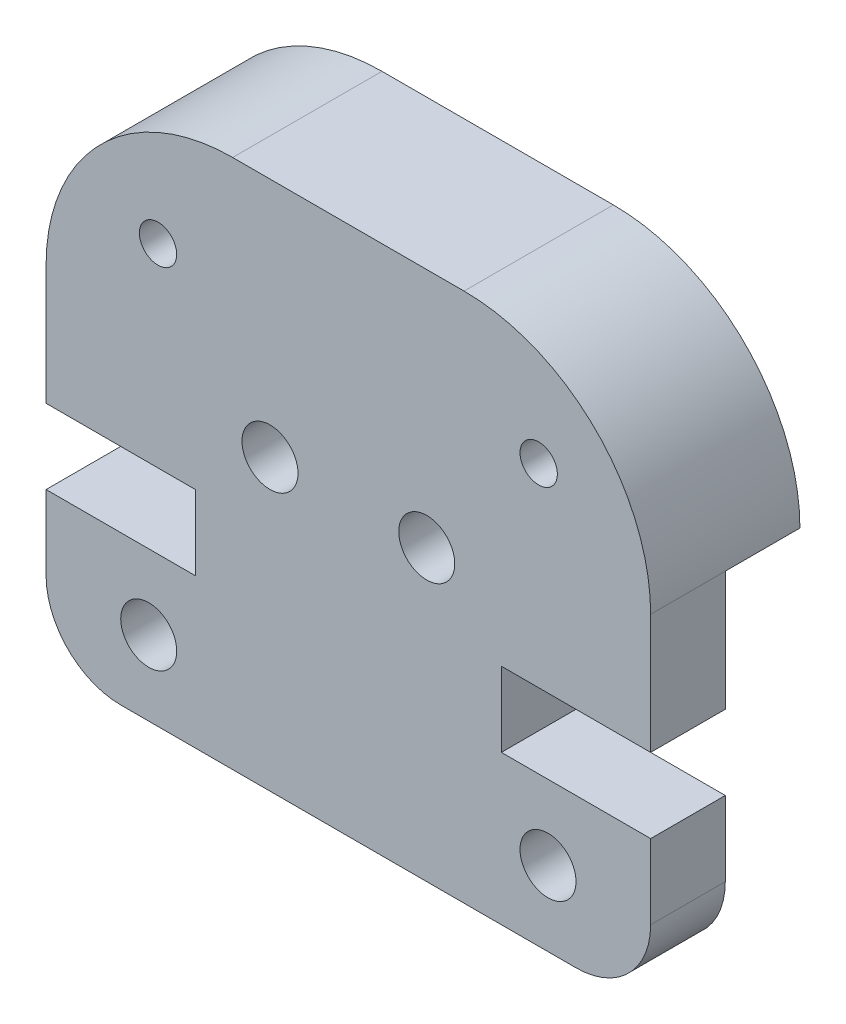
ISO-10303-21;
HEADER;
FILE_DESCRIPTION(('STEP AP214'),'2;1');
FILE_NAME('part.step','',(''),(''),'','','');
FILE_SCHEMA(('AUTOMOTIVE_DESIGN { 1 0 10303 214 1 1 1 1 }'));
ENDSEC;
DATA;
#1=APPLICATION_CONTEXT('core data for automotive mechanical design processes');
#2=APPLICATION_PROTOCOL_DEFINITION('international standard','automotive_design',2000,#1);
#3=PRODUCT_CONTEXT('',#1,'mechanical');
#4=PRODUCT('Part','Part','',(#3));
#5=PRODUCT_RELATED_PRODUCT_CATEGORY('part','',(#4));
#6=PRODUCT_DEFINITION_FORMATION('','',#4);
#7=PRODUCT_DEFINITION_CONTEXT('part definition',#1,'design');
#8=PRODUCT_DEFINITION('design','',#6,#7);
#9=PRODUCT_DEFINITION_SHAPE('','',#8);
#10=(LENGTH_UNIT() NAMED_UNIT(*) SI_UNIT(.MILLI.,.METRE.));
#11=(NAMED_UNIT(*) PLANE_ANGLE_UNIT() SI_UNIT($,.RADIAN.));
#12=(NAMED_UNIT(*) SI_UNIT($,.STERADIAN.) SOLID_ANGLE_UNIT());
#13=UNCERTAINTY_MEASURE_WITH_UNIT(LENGTH_MEASURE(1.E-05),#10,'distance_accuracy_value','');
#14=(GEOMETRIC_REPRESENTATION_CONTEXT(3) GLOBAL_UNCERTAINTY_ASSIGNED_CONTEXT((#13)) GLOBAL_UNIT_ASSIGNED_CONTEXT((#10,
#11,#12)) REPRESENTATION_CONTEXT('',''));
#15=CARTESIAN_POINT('',(0.,0.,0.));
#16=DIRECTION('',(0.,0.,1.));
#17=DIRECTION('',(1.,0.,0.));
#18=AXIS2_PLACEMENT_3D('',#15,#16,#17);
#19=CARTESIAN_POINT('',(14.2,2.00000000000002,4.));
#20=DIRECTION('',(0.,0.,-1.));
#21=DIRECTION('',(-1.,0.,0.));
#22=AXIS2_PLACEMENT_3D('',#19,#20,#21);
#23=CYLINDRICAL_SURFACE('',#22,2.00000000000001);
#24=CARTESIAN_POINT('',(14.2,2.00000000000002,2.));
#25=DIRECTION('',(0.,0.,-1.));
#26=DIRECTION('',(-1.,0.,0.));
#27=AXIS2_PLACEMENT_3D('',#24,#25,#26);
#28=CIRCLE('',#27,2.00000000000001);
#29=CARTESIAN_POINT('',(16.2,2.00000000000002,2.));
#30=VERTEX_POINT('',#29);
#31=CARTESIAN_POINT('',(14.2,0.,2.));
#32=VERTEX_POINT('',#31);
#33=EDGE_CURVE('E49',#30,#32,#28,.T.);
#34=ORIENTED_EDGE('',*,*,#33,.F.);
#35=DIRECTION('',(0.,0.,-1.));
#36=VECTOR('',#35,1.);
#37=CARTESIAN_POINT('',(16.2,2.00000000000002,4.));
#38=LINE('',#37,#36);
#39=CARTESIAN_POINT('',(16.2,2.00000000000002,4.));
#40=VERTEX_POINT('',#39);
#41=EDGE_CURVE('E11',#40,#30,#38,.T.);
#42=ORIENTED_EDGE('',*,*,#41,.F.);
#43=CARTESIAN_POINT('',(14.2,2.00000000000002,4.));
#44=DIRECTION('',(0.,0.,1.));
#45=DIRECTION('',(-1.,0.,0.));
#46=AXIS2_PLACEMENT_3D('',#43,#44,#45);
#47=CIRCLE('',#46,2.00000000000001);
#48=CARTESIAN_POINT('',(14.2,0.,4.));
#49=VERTEX_POINT('',#48);
#50=EDGE_CURVE('E160',#49,#40,#47,.T.);
#51=ORIENTED_EDGE('',*,*,#50,.F.);
#52=DIRECTION('',(0.,0.,-1.));
#53=VECTOR('',#52,1.);
#54=CARTESIAN_POINT('',(14.2,0.,4.));
#55=LINE('',#54,#53);
#56=EDGE_CURVE('E149',#49,#32,#55,.T.);
#57=ORIENTED_EDGE('',*,*,#56,.T.);
#58=EDGE_LOOP('',(#34,#42,#51,#57));
#59=FACE_BOUND('',#58,.T.);
#60=ADVANCED_FACE('F34',(#59),#23,.T.);
#61=CARTESIAN_POINT('',(16.2,2.00000000000002,4.));
#62=DIRECTION('',(-1.,0.,0.));
#63=DIRECTION('',(0.,0.,1.));
#64=AXIS2_PLACEMENT_3D('',#61,#62,#63);
#65=PLANE('',#64);
#66=DIRECTION('',(0.,-1.,0.));
#67=VECTOR('',#66,1.);
#68=CARTESIAN_POINT('',(16.2,9.205,2.));
#69=LINE('',#68,#67);
#70=CARTESIAN_POINT('',(16.2,4.00000000000002,2.));
#71=VERTEX_POINT('',#70);
#72=EDGE_CURVE('E208',#71,#30,#69,.T.);
#73=ORIENTED_EDGE('',*,*,#72,.F.);
#74=DIRECTION('',(0.,0.,-1.));
#75=VECTOR('',#74,1.);
#76=CARTESIAN_POINT('',(16.2,4.00000000000002,4.));
#77=LINE('',#76,#75);
#78=CARTESIAN_POINT('',(16.2,4.00000000000002,4.));
#79=VERTEX_POINT('',#78);
#80=EDGE_CURVE('E42',#79,#71,#77,.T.);
#81=ORIENTED_EDGE('',*,*,#80,.F.);
#82=DIRECTION('',(0.,1.,0.));
#83=VECTOR('',#82,1.);
#84=CARTESIAN_POINT('',(16.2,2.00000000000002,4.));
#85=LINE('',#84,#83);
#86=EDGE_CURVE('E82',#40,#79,#85,.T.);
#87=ORIENTED_EDGE('',*,*,#86,.F.);
#88=ORIENTED_EDGE('',*,*,#41,.T.);
#89=EDGE_LOOP('',(#73,#81,#87,#88));
#90=FACE_BOUND('',#89,.T.);
#91=ADVANCED_FACE('F207',(#90),#65,.F.);
#92=CARTESIAN_POINT('',(12.2,4.00000000000002,4.));
#93=DIRECTION('',(0.,-1.,0.));
#94=DIRECTION('',(1.,0.,0.));
#95=AXIS2_PLACEMENT_3D('',#92,#93,#94);
#96=PLANE('',#95);
#97=DIRECTION('',(1.,0.,0.));
#98=VECTOR('',#97,1.);
#99=CARTESIAN_POINT('',(12.2,4.00000000000002,2.));
#100=LINE('',#99,#98);
#101=CARTESIAN_POINT('',(12.2,4.00000000000002,2.));
#102=VERTEX_POINT('',#101);
#103=EDGE_CURVE('E201',#102,#71,#100,.T.);
#104=ORIENTED_EDGE('',*,*,#103,.F.);
#105=DIRECTION('',(0.,0.,-1.));
#106=VECTOR('',#105,1.);
#107=CARTESIAN_POINT('',(12.2,4.00000000000002,4.));
#108=LINE('',#107,#106);
#109=CARTESIAN_POINT('',(12.2,4.00000000000002,4.));
#110=VERTEX_POINT('',#109);
#111=EDGE_CURVE('E190',#110,#102,#108,.T.);
#112=ORIENTED_EDGE('',*,*,#111,.F.);
#113=DIRECTION('',(-1.,0.,0.));
#114=VECTOR('',#113,1.);
#115=CARTESIAN_POINT('',(12.2,4.00000000000002,4.));
#116=LINE('',#115,#114);
#117=EDGE_CURVE('E202',#79,#110,#116,.T.);
#118=ORIENTED_EDGE('',*,*,#117,.F.);
#119=ORIENTED_EDGE('',*,*,#80,.T.);
#120=EDGE_LOOP('',(#104,#112,#118,#119));
#121=FACE_BOUND('',#120,.T.);
#122=ADVANCED_FACE('F198',(#121),#96,.F.);
#123=CARTESIAN_POINT('',(12.2,6.00000000000003,4.));
#124=DIRECTION('',(-1.,0.,0.));
#125=DIRECTION('',(0.,-1.,0.));
#126=AXIS2_PLACEMENT_3D('',#123,#124,#125);
#127=PLANE('',#126);
#128=DIRECTION('',(0.,-1.,0.));
#129=VECTOR('',#128,1.);
#130=CARTESIAN_POINT('',(12.2,6.00000000000003,2.));
#131=LINE('',#130,#129);
#132=CARTESIAN_POINT('',(12.2,6.00000000000003,2.));
#133=VERTEX_POINT('',#132);
#134=EDGE_CURVE('E252',#133,#102,#131,.T.);
#135=ORIENTED_EDGE('',*,*,#134,.F.);
#136=DIRECTION('',(0.,0.,-1.));
#137=VECTOR('',#136,1.);
#138=CARTESIAN_POINT('',(12.2,6.00000000000003,4.));
#139=LINE('',#138,#137);
#140=CARTESIAN_POINT('',(12.2,6.00000000000003,4.));
#141=VERTEX_POINT('',#140);
#142=EDGE_CURVE('E187',#141,#133,#139,.T.);
#143=ORIENTED_EDGE('',*,*,#142,.F.);
#144=DIRECTION('',(0.,1.,0.));
#145=VECTOR('',#144,1.);
#146=CARTESIAN_POINT('',(12.2,6.00000000000003,4.));
#147=LINE('',#146,#145);
#148=EDGE_CURVE('E283',#110,#141,#147,.T.);
#149=ORIENTED_EDGE('',*,*,#148,.F.);
#150=ORIENTED_EDGE('',*,*,#111,.T.);
#151=EDGE_LOOP('',(#135,#143,#149,#150));
#152=FACE_BOUND('',#151,.T.);
#153=ADVANCED_FACE('F326',(#152),#127,.F.);
#154=CARTESIAN_POINT('',(16.2,6.00000000000003,4.));
#155=DIRECTION('',(0.,1.,0.));
#156=DIRECTION('',(-1.,0.,0.));
#157=AXIS2_PLACEMENT_3D('',#154,#155,#156);
#158=PLANE('',#157);
#159=DIRECTION('',(-1.,0.,0.));
#160=VECTOR('',#159,1.);
#161=CARTESIAN_POINT('',(16.2,6.00000000000003,2.));
#162=LINE('',#161,#160);
#163=CARTESIAN_POINT('',(16.2,6.00000000000003,2.));
#164=VERTEX_POINT('',#163);
#165=EDGE_CURVE('E249',#164,#133,#162,.T.);
#166=ORIENTED_EDGE('',*,*,#165,.F.);
#167=DIRECTION('',(0.,0.,-1.));
#168=VECTOR('',#167,1.);
#169=CARTESIAN_POINT('',(16.2,6.00000000000003,4.));
#170=LINE('',#169,#168);
#171=CARTESIAN_POINT('',(16.2,6.00000000000003,4.));
#172=VERTEX_POINT('',#171);
#173=EDGE_CURVE('E184',#172,#164,#170,.T.);
#174=ORIENTED_EDGE('',*,*,#173,.F.);
#175=DIRECTION('',(1.,0.,0.));
#176=VECTOR('',#175,1.);
#177=CARTESIAN_POINT('',(16.2,6.00000000000003,4.));
#178=LINE('',#177,#176);
#179=EDGE_CURVE('E285',#141,#172,#178,.T.);
#180=ORIENTED_EDGE('',*,*,#179,.F.);
#181=ORIENTED_EDGE('',*,*,#142,.T.);
#182=EDGE_LOOP('',(#166,#174,#180,#181));
#183=FACE_BOUND('',#182,.T.);
#184=ADVANCED_FACE('F330',(#183),#158,.F.);
#185=CARTESIAN_POINT('',(16.2,9.205,4.));
#186=DIRECTION('',(-1.,0.,0.));
#187=DIRECTION('',(0.,-1.,0.));
#188=AXIS2_PLACEMENT_3D('',#185,#186,#187);
#189=PLANE('',#188);
#190=CARTESIAN_POINT('',(16.2,9.205,2.));
#191=VERTEX_POINT('',#190);
#192=EDGE_CURVE('E210',#191,#164,#69,.T.);
#193=ORIENTED_EDGE('',*,*,#192,.F.);
#194=DIRECTION('',(0.,0.,-1.));
#195=VECTOR('',#194,1.);
#196=CARTESIAN_POINT('',(16.2,9.205,4.));
#197=LINE('',#196,#195);
#198=CARTESIAN_POINT('',(16.2,9.205,4.));
#199=VERTEX_POINT('',#198);
#200=EDGE_CURVE('E181',#199,#191,#197,.T.);
#201=ORIENTED_EDGE('',*,*,#200,.F.);
#202=DIRECTION('',(0.,1.,0.));
#203=VECTOR('',#202,1.);
#204=CARTESIAN_POINT('',(16.2,9.205,4.));
#205=LINE('',#204,#203);
#206=EDGE_CURVE('E287',#172,#199,#205,.T.);
#207=ORIENTED_EDGE('',*,*,#206,.F.);
#208=ORIENTED_EDGE('',*,*,#173,.T.);
#209=EDGE_LOOP('',(#193,#201,#207,#208));
#210=FACE_BOUND('',#209,.T.);
#211=ADVANCED_FACE('F377',(#210),#189,.F.);
#212=CARTESIAN_POINT('',(0.,9.20499999999999,4.));
#213=DIRECTION('',(1.,0.,0.));
#214=DIRECTION('',(0.,0.,-1.));
#215=AXIS2_PLACEMENT_3D('',#212,#213,#214);
#216=PLANE('',#215);
#217=DIRECTION('',(0.,1.,0.));
#218=VECTOR('',#217,1.);
#219=CARTESIAN_POINT('',(0.,0.,2.));
#220=LINE('',#219,#218);
#221=CARTESIAN_POINT('',(0.,6.00000000000003,2.));
#222=VERTEX_POINT('',#221);
#223=CARTESIAN_POINT('',(0.,9.20499999999999,2.));
#224=VERTEX_POINT('',#223);
#225=EDGE_CURVE('E350',#222,#224,#220,.T.);
#226=ORIENTED_EDGE('',*,*,#225,.F.);
#227=DIRECTION('',(0.,0.,-1.));
#228=VECTOR('',#227,1.);
#229=CARTESIAN_POINT('',(0.,6.00000000000003,4.));
#230=LINE('',#229,#228);
#231=CARTESIAN_POINT('',(0.,6.00000000000003,4.));
#232=VERTEX_POINT('',#231);
#233=EDGE_CURVE('E171',#232,#222,#230,.T.);
#234=ORIENTED_EDGE('',*,*,#233,.F.);
#235=DIRECTION('',(0.,-1.,0.));
#236=VECTOR('',#235,1.);
#237=CARTESIAN_POINT('',(0.,9.20499999999999,4.));
#238=LINE('',#237,#236);
#239=CARTESIAN_POINT('',(0.,9.20499999999999,4.));
#240=VERTEX_POINT('',#239);
#241=EDGE_CURVE('E295',#240,#232,#238,.T.);
#242=ORIENTED_EDGE('',*,*,#241,.F.);
#243=DIRECTION('',(0.,0.,-1.));
#244=VECTOR('',#243,1.);
#245=CARTESIAN_POINT('',(0.,9.20499999999999,4.));
#246=LINE('',#245,#244);
#247=EDGE_CURVE('E174',#240,#224,#246,.T.);
#248=ORIENTED_EDGE('',*,*,#247,.T.);
#249=EDGE_LOOP('',(#226,#234,#242,#248));
#250=FACE_BOUND('',#249,.T.);
#251=ADVANCED_FACE('F366',(#250),#216,.F.);
#252=CARTESIAN_POINT('',(0.,6.00000000000003,4.));
#253=DIRECTION('',(0.,1.,0.));
#254=DIRECTION('',(-1.,0.,0.));
#255=AXIS2_PLACEMENT_3D('',#252,#253,#254);
#256=PLANE('',#255);
#257=DIRECTION('',(-1.,0.,0.));
#258=VECTOR('',#257,1.);
#259=CARTESIAN_POINT('',(0.,6.00000000000003,2.));
#260=LINE('',#259,#258);
#261=CARTESIAN_POINT('',(4.00000000000001,6.00000000000003,2.));
#262=VERTEX_POINT('',#261);
#263=EDGE_CURVE('E246',#262,#222,#260,.T.);
#264=ORIENTED_EDGE('',*,*,#263,.F.);
#265=DIRECTION('',(0.,0.,-1.));
#266=VECTOR('',#265,1.);
#267=CARTESIAN_POINT('',(4.00000000000001,6.00000000000003,4.));
#268=LINE('',#267,#266);
#269=CARTESIAN_POINT('',(4.00000000000001,6.00000000000003,4.));
#270=VERTEX_POINT('',#269);
#271=EDGE_CURVE('E168',#270,#262,#268,.T.);
#272=ORIENTED_EDGE('',*,*,#271,.F.);
#273=DIRECTION('',(1.,0.,0.));
#274=VECTOR('',#273,1.);
#275=CARTESIAN_POINT('',(0.,6.00000000000003,4.));
#276=LINE('',#275,#274);
#277=EDGE_CURVE('E297',#232,#270,#276,.T.);
#278=ORIENTED_EDGE('',*,*,#277,.F.);
#279=ORIENTED_EDGE('',*,*,#233,.T.);
#280=EDGE_LOOP('',(#264,#272,#278,#279));
#281=FACE_BOUND('',#280,.T.);
#282=ADVANCED_FACE('F384',(#281),#256,.F.);
#283=CARTESIAN_POINT('',(4.00000000000001,6.00000000000003,4.));
#284=DIRECTION('',(1.,0.,0.));
#285=DIRECTION('',(0.,0.,-1.));
#286=AXIS2_PLACEMENT_3D('',#283,#284,#285);
#287=PLANE('',#286);
#288=DIRECTION('',(0.,1.,0.));
#289=VECTOR('',#288,1.);
#290=CARTESIAN_POINT('',(4.00000000000001,6.00000000000003,2.));
#291=LINE('',#290,#289);
#292=CARTESIAN_POINT('',(4.00000000000001,4.00000000000002,2.));
#293=VERTEX_POINT('',#292);
#294=EDGE_CURVE('E243',#293,#262,#291,.T.);
#295=ORIENTED_EDGE('',*,*,#294,.F.);
#296=DIRECTION('',(0.,0.,-1.));
#297=VECTOR('',#296,1.);
#298=CARTESIAN_POINT('',(4.00000000000001,4.00000000000002,4.));
#299=LINE('',#298,#297);
#300=CARTESIAN_POINT('',(4.00000000000001,4.00000000000002,4.));
#301=VERTEX_POINT('',#300);
#302=EDGE_CURVE('E165',#301,#293,#299,.T.);
#303=ORIENTED_EDGE('',*,*,#302,.F.);
#304=DIRECTION('',(0.,-1.,0.));
#305=VECTOR('',#304,1.);
#306=CARTESIAN_POINT('',(4.00000000000001,6.00000000000003,4.));
#307=LINE('',#306,#305);
#308=EDGE_CURVE('E299',#270,#301,#307,.T.);
#309=ORIENTED_EDGE('',*,*,#308,.F.);
#310=ORIENTED_EDGE('',*,*,#271,.T.);
#311=EDGE_LOOP('',(#295,#303,#309,#310));
#312=FACE_BOUND('',#311,.T.);
#313=ADVANCED_FACE('F306',(#312),#287,.F.);
#314=CARTESIAN_POINT('',(4.00000000000001,4.00000000000002,4.));
#315=DIRECTION('',(0.,-1.,0.));
#316=DIRECTION('',(1.,0.,0.));
#317=AXIS2_PLACEMENT_3D('',#314,#315,#316);
#318=PLANE('',#317);
#319=DIRECTION('',(1.,0.,0.));
#320=VECTOR('',#319,1.);
#321=CARTESIAN_POINT('',(4.00000000000001,4.00000000000002,2.));
#322=LINE('',#321,#320);
#323=CARTESIAN_POINT('',(0.,4.00000000000003,2.));
#324=VERTEX_POINT('',#323);
#325=EDGE_CURVE('E240',#324,#293,#322,.T.);
#326=ORIENTED_EDGE('',*,*,#325,.F.);
#327=DIRECTION('',(0.,0.,-1.));
#328=VECTOR('',#327,1.);
#329=CARTESIAN_POINT('',(0.,4.00000000000003,4.));
#330=LINE('',#329,#328);
#331=CARTESIAN_POINT('',(0.,4.00000000000003,4.));
#332=VERTEX_POINT('',#331);
#333=EDGE_CURVE('E143',#332,#324,#330,.T.);
#334=ORIENTED_EDGE('',*,*,#333,.F.);
#335=DIRECTION('',(-1.,0.,0.));
#336=VECTOR('',#335,1.);
#337=CARTESIAN_POINT('',(4.00000000000001,4.00000000000002,4.));
#338=LINE('',#337,#336);
#339=EDGE_CURVE('E129',#301,#332,#338,.T.);
#340=ORIENTED_EDGE('',*,*,#339,.F.);
#341=ORIENTED_EDGE('',*,*,#302,.T.);
#342=EDGE_LOOP('',(#326,#334,#340,#341));
#343=FACE_BOUND('',#342,.T.);
#344=ADVANCED_FACE('F310',(#343),#318,.F.);
#345=CARTESIAN_POINT('',(0.,2.00000000000001,4.));
#346=DIRECTION('',(1.,0.,0.));
#347=DIRECTION('',(0.,0.,-1.));
#348=AXIS2_PLACEMENT_3D('',#345,#346,#347);
#349=PLANE('',#348);
#350=CARTESIAN_POINT('',(0.,2.00000000000001,2.));
#351=VERTEX_POINT('',#350);
#352=EDGE_CURVE('E140',#351,#324,#220,.T.);
#353=ORIENTED_EDGE('',*,*,#352,.F.);
#354=DIRECTION('',(0.,0.,-1.));
#355=VECTOR('',#354,1.);
#356=CARTESIAN_POINT('',(0.,2.00000000000001,4.));
#357=LINE('',#356,#355);
#358=CARTESIAN_POINT('',(0.,2.00000000000001,4.));
#359=VERTEX_POINT('',#358);
#360=EDGE_CURVE('E136',#359,#351,#357,.T.);
#361=ORIENTED_EDGE('',*,*,#360,.F.);
#362=DIRECTION('',(0.,-1.,0.));
#363=VECTOR('',#362,1.);
#364=CARTESIAN_POINT('',(0.,2.00000000000001,4.));
#365=LINE('',#364,#363);
#366=EDGE_CURVE('E121',#332,#359,#365,.T.);
#367=ORIENTED_EDGE('',*,*,#366,.F.);
#368=ORIENTED_EDGE('',*,*,#333,.T.);
#369=EDGE_LOOP('',(#353,#361,#367,#368));
#370=FACE_BOUND('',#369,.T.);
#371=ADVANCED_FACE('F137',(#370),#349,.F.);
#372=CARTESIAN_POINT('',(2.,2.00000000000001,4.));
#373=DIRECTION('',(0.,0.,-1.));
#374=DIRECTION('',(-1.,0.,0.));
#375=AXIS2_PLACEMENT_3D('',#372,#373,#374);
#376=CYLINDRICAL_SURFACE('',#375,2.00000000000001);
#377=CARTESIAN_POINT('',(2.,2.00000000000001,2.));
#378=DIRECTION('',(0.,0.,-1.));
#379=DIRECTION('',(-1.,0.,0.));
#380=AXIS2_PLACEMENT_3D('',#377,#378,#379);
#381=CIRCLE('',#380,2.00000000000001);
#382=CARTESIAN_POINT('',(2.,0.,2.));
#383=VERTEX_POINT('',#382);
#384=EDGE_CURVE('E237',#383,#351,#381,.T.);
#385=ORIENTED_EDGE('',*,*,#384,.F.);
#386=DIRECTION('',(0.,0.,-1.));
#387=VECTOR('',#386,1.);
#388=CARTESIAN_POINT('',(2.,0.,4.));
#389=LINE('',#388,#387);
#390=CARTESIAN_POINT('',(2.,0.,4.));
#391=VERTEX_POINT('',#390);
#392=EDGE_CURVE('E144',#391,#383,#389,.T.);
#393=ORIENTED_EDGE('',*,*,#392,.F.);
#394=CARTESIAN_POINT('',(2.,2.00000000000001,4.));
#395=DIRECTION('',(0.,0.,1.));
#396=DIRECTION('',(1.,0.,0.));
#397=AXIS2_PLACEMENT_3D('',#394,#395,#396);
#398=CIRCLE('',#397,2.00000000000001);
#399=EDGE_CURVE('E126',#359,#391,#398,.T.);
#400=ORIENTED_EDGE('',*,*,#399,.F.);
#401=ORIENTED_EDGE('',*,*,#360,.T.);
#402=EDGE_LOOP('',(#385,#393,#400,#401));
#403=FACE_BOUND('',#402,.T.);
#404=ADVANCED_FACE('F146',(#403),#376,.T.);
#405=CARTESIAN_POINT('',(2.,0.,4.));
#406=DIRECTION('',(0.,1.,0.));
#407=DIRECTION('',(-1.,0.,0.));
#408=AXIS2_PLACEMENT_3D('',#405,#406,#407);
#409=PLANE('',#408);
#410=DIRECTION('',(-1.,0.,0.));
#411=VECTOR('',#410,1.);
#412=CARTESIAN_POINT('',(16.2,0.,2.));
#413=LINE('',#412,#411);
#414=EDGE_CURVE('E222',#32,#383,#413,.T.);
#415=ORIENTED_EDGE('',*,*,#414,.F.);
#416=ORIENTED_EDGE('',*,*,#56,.F.);
#417=DIRECTION('',(1.,0.,0.));
#418=VECTOR('',#417,1.);
#419=CARTESIAN_POINT('',(2.,0.,4.));
#420=LINE('',#419,#418);
#421=EDGE_CURVE('E58',#391,#49,#420,.T.);
#422=ORIENTED_EDGE('',*,*,#421,.F.);
#423=ORIENTED_EDGE('',*,*,#392,.T.);
#424=EDGE_LOOP('',(#415,#416,#422,#423));
#425=FACE_BOUND('',#424,.T.);
#426=ADVANCED_FACE('F458',(#425),#409,.F.);
#427=CARTESIAN_POINT('',(13.45,2.00000000000002,4.));
#428=DIRECTION('',(0.,0.,-1.));
#429=DIRECTION('',(-1.,0.,0.));
#430=AXIS2_PLACEMENT_3D('',#427,#428,#429);
#431=CYLINDRICAL_SURFACE('',#430,0.750000000000008);
#432=CARTESIAN_POINT('',(13.45,2.00000000000002,4.));
#433=DIRECTION('',(0.,0.,1.));
#434=DIRECTION('',(-1.,0.,0.));
#435=AXIS2_PLACEMENT_3D('',#432,#433,#434);
#436=CIRCLE('',#435,0.750000000000008);
#437=CARTESIAN_POINT('',(12.7,2.00000000000002,4.));
#438=VERTEX_POINT('',#437);
#439=EDGE_CURVE('E155',#438,#438,#436,.T.);
#440=ORIENTED_EDGE('',*,*,#439,.T.);
#441=EDGE_LOOP('',(#440));
#442=FACE_BOUND('',#441,.T.);
#443=CARTESIAN_POINT('',(13.45,2.00000000000002,2.));
#444=DIRECTION('',(0.,0.,-1.));
#445=DIRECTION('',(-1.,0.,0.));
#446=AXIS2_PLACEMENT_3D('',#443,#444,#445);
#447=CIRCLE('',#446,0.750000000000008);
#448=CARTESIAN_POINT('',(12.7,2.00000000000002,2.));
#449=VERTEX_POINT('',#448);
#450=EDGE_CURVE('E234',#449,#449,#447,.T.);
#451=ORIENTED_EDGE('',*,*,#450,.T.);
#452=EDGE_LOOP('',(#451));
#453=FACE_BOUND('',#452,.T.);
#454=ADVANCED_FACE('F467',(#442,#453),#431,.F.);
#455=CARTESIAN_POINT('',(10.2000000000053,7.75,4.));
#456=DIRECTION('',(0.,0.,-1.));
#457=DIRECTION('',(-1.,0.,0.));
#458=AXIS2_PLACEMENT_3D('',#455,#456,#457);
#459=CYLINDRICAL_SURFACE('',#458,0.75);
#460=CARTESIAN_POINT('',(10.2000000000053,7.75,4.));
#461=DIRECTION('',(0.,0.,1.));
#462=DIRECTION('',(-1.,0.,0.));
#463=AXIS2_PLACEMENT_3D('',#460,#461,#462);
#464=CIRCLE('',#463,0.75);
#465=CARTESIAN_POINT('',(9.45000000000532,7.75,4.));
#466=VERTEX_POINT('',#465);
#467=EDGE_CURVE('E269',#466,#466,#464,.T.);
#468=ORIENTED_EDGE('',*,*,#467,.T.);
#469=EDGE_LOOP('',(#468));
#470=FACE_BOUND('',#469,.T.);
#471=CARTESIAN_POINT('',(10.2000000000053,7.75,2.));
#472=DIRECTION('',(0.,0.,-1.));
#473=DIRECTION('',(-1.,0.,0.));
#474=AXIS2_PLACEMENT_3D('',#471,#472,#473);
#475=CIRCLE('',#474,0.75);
#476=CARTESIAN_POINT('',(9.45000000000532,7.75,2.));
#477=VERTEX_POINT('',#476);
#478=EDGE_CURVE('E231',#477,#477,#475,.T.);
#479=ORIENTED_EDGE('',*,*,#478,.T.);
#480=EDGE_LOOP('',(#479));
#481=FACE_BOUND('',#480,.T.);
#482=ADVANCED_FACE('F477',(#470,#481),#459,.F.);
#483=CARTESIAN_POINT('',(5.99999999999468,7.75,4.));
#484=DIRECTION('',(0.,0.,-1.));
#485=DIRECTION('',(-1.,0.,0.));
#486=AXIS2_PLACEMENT_3D('',#483,#484,#485);
#487=CYLINDRICAL_SURFACE('',#486,0.75);
#488=CARTESIAN_POINT('',(5.99999999999468,7.75,4.));
#489=DIRECTION('',(0.,0.,1.));
#490=DIRECTION('',(1.,0.,0.));
#491=AXIS2_PLACEMENT_3D('',#488,#489,#490);
#492=CIRCLE('',#491,0.75);
#493=CARTESIAN_POINT('',(6.74999999999468,7.75,4.));
#494=VERTEX_POINT('',#493);
#495=EDGE_CURVE('E264',#494,#494,#492,.T.);
#496=ORIENTED_EDGE('',*,*,#495,.T.);
#497=EDGE_LOOP('',(#496));
#498=FACE_BOUND('',#497,.T.);
#499=CARTESIAN_POINT('',(5.99999999999468,7.75,2.));
#500=DIRECTION('',(0.,0.,-1.));
#501=DIRECTION('',(-1.,0.,0.));
#502=AXIS2_PLACEMENT_3D('',#499,#500,#501);
#503=CIRCLE('',#502,0.75);
#504=CARTESIAN_POINT('',(5.24999999999468,7.75,2.));
#505=VERTEX_POINT('',#504);
#506=EDGE_CURVE('E228',#505,#505,#503,.T.);
#507=ORIENTED_EDGE('',*,*,#506,.T.);
#508=EDGE_LOOP('',(#507));
#509=FACE_BOUND('',#508,.T.);
#510=ADVANCED_FACE('F487',(#498,#509),#487,.F.);
#511=CARTESIAN_POINT('',(2.75,2.00000000000018,4.));
#512=DIRECTION('',(0.,0.,-1.));
#513=DIRECTION('',(-1.,0.,0.));
#514=AXIS2_PLACEMENT_3D('',#511,#512,#513);
#515=CYLINDRICAL_SURFACE('',#514,0.750000000000887);
#516=CARTESIAN_POINT('',(2.75,2.00000000000018,4.));
#517=DIRECTION('',(0.,0.,1.));
#518=DIRECTION('',(1.,0.,0.));
#519=AXIS2_PLACEMENT_3D('',#516,#517,#518);
#520=CIRCLE('',#519,0.750000000000887);
#521=CARTESIAN_POINT('',(3.50000000000089,2.00000000000018,4.));
#522=VERTEX_POINT('',#521);
#523=EDGE_CURVE('E257',#522,#522,#520,.T.);
#524=ORIENTED_EDGE('',*,*,#523,.T.);
#525=EDGE_LOOP('',(#524));
#526=FACE_BOUND('',#525,.T.);
#527=CARTESIAN_POINT('',(2.75,2.00000000000018,2.));
#528=DIRECTION('',(0.,0.,-1.));
#529=DIRECTION('',(-1.,0.,0.));
#530=AXIS2_PLACEMENT_3D('',#527,#528,#529);
#531=CIRCLE('',#530,0.750000000000887);
#532=CARTESIAN_POINT('',(1.99999999999912,2.00000000000018,2.));
#533=VERTEX_POINT('',#532);
#534=EDGE_CURVE('E37',#533,#533,#531,.T.);
#535=ORIENTED_EDGE('',*,*,#534,.T.);
#536=EDGE_LOOP('',(#535));
#537=FACE_BOUND('',#536,.T.);
#538=ADVANCED_FACE('F497',(#526,#537),#515,.F.);
#539=CARTESIAN_POINT('',(14.2,2.00000000000002,4.));
#540=DIRECTION('',(0.,0.,-1.));
#541=DIRECTION('',(-1.,0.,0.));
#542=AXIS2_PLACEMENT_3D('',#539,#540,#541);
#543=PLANE('',#542);
#544=CARTESIAN_POINT('',(3.00000000000434,11.2049999999999,4.));
#545=DIRECTION('',(0.,0.,1.));
#546=DIRECTION('',(1.,0.,0.));
#547=AXIS2_PLACEMENT_3D('',#544,#545,#546);
#548=CIRCLE('',#547,0.499999999999944);
#549=CARTESIAN_POINT('',(3.50000000000429,11.2049999999999,4.));
#550=VERTEX_POINT('',#549);
#551=EDGE_CURVE('E261',#550,#550,#548,.T.);
#552=ORIENTED_EDGE('',*,*,#551,.F.);
#553=EDGE_LOOP('',(#552));
#554=FACE_BOUND('',#553,.T.);
#555=ORIENTED_EDGE('',*,*,#467,.F.);
#556=EDGE_LOOP('',(#555));
#557=FACE_BOUND('',#556,.T.);
#558=ORIENTED_EDGE('',*,*,#439,.F.);
#559=EDGE_LOOP('',(#558));
#560=FACE_BOUND('',#559,.T.);
#561=ORIENTED_EDGE('',*,*,#50,.T.);
#562=ORIENTED_EDGE('',*,*,#86,.T.);
#563=ORIENTED_EDGE('',*,*,#117,.T.);
#564=ORIENTED_EDGE('',*,*,#148,.T.);
#565=ORIENTED_EDGE('',*,*,#179,.T.);
#566=ORIENTED_EDGE('',*,*,#206,.T.);
#567=CARTESIAN_POINT('',(11.2,9.20499999999999,4.));
#568=DIRECTION('',(0.,0.,1.));
#569=DIRECTION('',(-1.,0.,0.));
#570=AXIS2_PLACEMENT_3D('',#567,#568,#569);
#571=CIRCLE('',#570,5.);
#572=CARTESIAN_POINT('',(11.2,14.205,4.));
#573=VERTEX_POINT('',#572);
#574=EDGE_CURVE('E289',#199,#573,#571,.T.);
#575=ORIENTED_EDGE('',*,*,#574,.T.);
#576=DIRECTION('',(-1.,0.,0.));
#577=VECTOR('',#576,1.);
#578=CARTESIAN_POINT('',(5.,14.205,4.));
#579=LINE('',#578,#577);
#580=CARTESIAN_POINT('',(5.,14.205,4.));
#581=VERTEX_POINT('',#580);
#582=EDGE_CURVE('E291',#573,#581,#579,.T.);
#583=ORIENTED_EDGE('',*,*,#582,.T.);
#584=CARTESIAN_POINT('',(5.,9.20499999999999,4.));
#585=DIRECTION('',(0.,0.,1.));
#586=DIRECTION('',(1.,0.,0.));
#587=AXIS2_PLACEMENT_3D('',#584,#585,#586);
#588=CIRCLE('',#587,5.);
#589=EDGE_CURVE('E293',#581,#240,#588,.T.);
#590=ORIENTED_EDGE('',*,*,#589,.T.);
#591=ORIENTED_EDGE('',*,*,#241,.T.);
#592=ORIENTED_EDGE('',*,*,#277,.T.);
#593=ORIENTED_EDGE('',*,*,#308,.T.);
#594=ORIENTED_EDGE('',*,*,#339,.T.);
#595=ORIENTED_EDGE('',*,*,#366,.T.);
#596=ORIENTED_EDGE('',*,*,#399,.T.);
#597=ORIENTED_EDGE('',*,*,#421,.T.);
#598=EDGE_LOOP('',(#561,#562,#563,#564,#565,#566,#575,#583,#590,#591,#592,#593,#594,#595,#596,#597));
#599=FACE_BOUND('',#598,.T.);
#600=CARTESIAN_POINT('',(13.1999999999957,11.2049999999999,4.));
#601=DIRECTION('',(0.,0.,1.));
#602=DIRECTION('',(-1.,0.,0.));
#603=AXIS2_PLACEMENT_3D('',#600,#601,#602);
#604=CIRCLE('',#603,0.499999999999945);
#605=CARTESIAN_POINT('',(12.6999999999957,11.2049999999999,4.));
#606=VERTEX_POINT('',#605);
#607=EDGE_CURVE('E273',#606,#606,#604,.T.);
#608=ORIENTED_EDGE('',*,*,#607,.F.);
#609=EDGE_LOOP('',(#608));
#610=FACE_BOUND('',#609,.T.);
#611=ORIENTED_EDGE('',*,*,#495,.F.);
#612=EDGE_LOOP('',(#611));
#613=FACE_BOUND('',#612,.T.);
#614=ORIENTED_EDGE('',*,*,#523,.F.);
#615=EDGE_LOOP('',(#614));
#616=FACE_BOUND('',#615,.T.);
#617=ADVANCED_FACE('F123',(#554,#557,#560,#599,#610,#613,#616),#543,.F.);
#618=CARTESIAN_POINT('',(14.2,2.00000000000002,0.));
#619=DIRECTION('',(0.,0.,-1.));
#620=DIRECTION('',(-1.,0.,0.));
#621=AXIS2_PLACEMENT_3D('',#618,#619,#620);
#622=PLANE('',#621);
#623=DIRECTION('',(1.,0.,0.));
#624=VECTOR('',#623,1.);
#625=CARTESIAN_POINT('',(0.,9.20499999999999,0.));
#626=LINE('',#625,#624);
#627=CARTESIAN_POINT('',(0.,9.20499999999999,0.));
#628=VERTEX_POINT('',#627);
#629=CARTESIAN_POINT('',(16.2,9.205,0.));
#630=VERTEX_POINT('',#629);
#631=EDGE_CURVE('E219',#628,#630,#626,.T.);
#632=ORIENTED_EDGE('',*,*,#631,.F.);
#633=CARTESIAN_POINT('',(5.,9.20499999999999,0.));
#634=DIRECTION('',(0.,0.,1.));
#635=DIRECTION('',(1.,0.,0.));
#636=AXIS2_PLACEMENT_3D('',#633,#634,#635);
#637=CIRCLE('',#636,5.);
#638=CARTESIAN_POINT('',(5.,14.205,0.));
#639=VERTEX_POINT('',#638);
#640=EDGE_CURVE('E157',#639,#628,#637,.T.);
#641=ORIENTED_EDGE('',*,*,#640,.F.);
#642=DIRECTION('',(-1.,0.,0.));
#643=VECTOR('',#642,1.);
#644=CARTESIAN_POINT('',(5.,14.205,0.));
#645=LINE('',#644,#643);
#646=CARTESIAN_POINT('',(11.2,14.205,0.));
#647=VERTEX_POINT('',#646);
#648=EDGE_CURVE('E74',#647,#639,#645,.T.);
#649=ORIENTED_EDGE('',*,*,#648,.F.);
#650=CARTESIAN_POINT('',(11.2,9.20499999999999,0.));
#651=DIRECTION('',(0.,0.,1.));
#652=DIRECTION('',(-1.,0.,0.));
#653=AXIS2_PLACEMENT_3D('',#650,#651,#652);
#654=CIRCLE('',#653,5.);
#655=EDGE_CURVE('E153',#630,#647,#654,.T.);
#656=ORIENTED_EDGE('',*,*,#655,.F.);
#657=EDGE_LOOP('',(#632,#641,#649,#656));
#658=FACE_BOUND('',#657,.T.);
#659=CARTESIAN_POINT('',(3.00000000000434,11.2049999999999,0.));
#660=DIRECTION('',(0.,0.,1.));
#661=DIRECTION('',(1.,0.,0.));
#662=AXIS2_PLACEMENT_3D('',#659,#660,#661);
#663=CIRCLE('',#662,0.499999999999944);
#664=CARTESIAN_POINT('',(3.50000000000429,11.2049999999999,0.));
#665=VERTEX_POINT('',#664);
#666=EDGE_CURVE('E260',#665,#665,#663,.T.);
#667=ORIENTED_EDGE('',*,*,#666,.T.);
#668=EDGE_LOOP('',(#667));
#669=FACE_BOUND('',#668,.T.);
#670=CARTESIAN_POINT('',(13.1999999999957,11.2049999999999,0.));
#671=DIRECTION('',(0.,0.,1.));
#672=DIRECTION('',(-1.,0.,0.));
#673=AXIS2_PLACEMENT_3D('',#670,#671,#672);
#674=CIRCLE('',#673,0.499999999999945);
#675=CARTESIAN_POINT('',(12.6999999999957,11.2049999999999,0.));
#676=VERTEX_POINT('',#675);
#677=EDGE_CURVE('E272',#676,#676,#674,.T.);
#678=ORIENTED_EDGE('',*,*,#677,.T.);
#679=EDGE_LOOP('',(#678));
#680=FACE_BOUND('',#679,.T.);
#681=ADVANCED_FACE('F369',(#658,#669,#680),#622,.T.);
#682=CARTESIAN_POINT('',(11.2,9.20499999999999,4.));
#683=DIRECTION('',(0.,0.,-1.));
#684=DIRECTION('',(-1.,0.,0.));
#685=AXIS2_PLACEMENT_3D('',#682,#683,#684);
#686=CYLINDRICAL_SURFACE('',#685,5.);
#687=ORIENTED_EDGE('',*,*,#655,.T.);
#688=DIRECTION('',(0.,0.,-1.));
#689=VECTOR('',#688,1.);
#690=CARTESIAN_POINT('',(11.2,14.205,4.));
#691=LINE('',#690,#689);
#692=EDGE_CURVE('E179',#573,#647,#691,.T.);
#693=ORIENTED_EDGE('',*,*,#692,.F.);
#694=ORIENTED_EDGE('',*,*,#574,.F.);
#695=ORIENTED_EDGE('',*,*,#200,.T.);
#696=DIRECTION('',(0.,0.,-1.));
#697=VECTOR('',#696,1.);
#698=CARTESIAN_POINT('',(16.2,9.205,2.));
#699=LINE('',#698,#697);
#700=EDGE_CURVE('E223',#191,#630,#699,.T.);
#701=ORIENTED_EDGE('',*,*,#700,.T.);
#702=EDGE_LOOP('',(#687,#693,#694,#695,#701));
#703=FACE_BOUND('',#702,.T.);
#704=ADVANCED_FACE('F373',(#703),#686,.T.);
#705=CARTESIAN_POINT('',(5.,14.205,4.));
#706=DIRECTION('',(0.,-1.,0.));
#707=DIRECTION('',(0.,0.,-1.));
#708=AXIS2_PLACEMENT_3D('',#705,#706,#707);
#709=PLANE('',#708);
#710=ORIENTED_EDGE('',*,*,#648,.T.);
#711=DIRECTION('',(0.,0.,-1.));
#712=VECTOR('',#711,1.);
#713=CARTESIAN_POINT('',(5.,14.205,4.));
#714=LINE('',#713,#712);
#715=EDGE_CURVE('E177',#581,#639,#714,.T.);
#716=ORIENTED_EDGE('',*,*,#715,.F.);
#717=ORIENTED_EDGE('',*,*,#582,.F.);
#718=ORIENTED_EDGE('',*,*,#692,.T.);
#719=EDGE_LOOP('',(#710,#716,#717,#718));
#720=FACE_BOUND('',#719,.T.);
#721=ADVANCED_FACE('F527',(#720),#709,.F.);
#722=CARTESIAN_POINT('',(5.,9.20499999999999,4.));
#723=DIRECTION('',(0.,0.,-1.));
#724=DIRECTION('',(-1.,0.,0.));
#725=AXIS2_PLACEMENT_3D('',#722,#723,#724);
#726=CYLINDRICAL_SURFACE('',#725,5.);
#727=ORIENTED_EDGE('',*,*,#640,.T.);
#728=DIRECTION('',(0.,0.,-1.));
#729=VECTOR('',#728,1.);
#730=CARTESIAN_POINT('',(0.,9.20499999999999,2.));
#731=LINE('',#730,#729);
#732=EDGE_CURVE('E214',#224,#628,#731,.T.);
#733=ORIENTED_EDGE('',*,*,#732,.F.);
#734=ORIENTED_EDGE('',*,*,#247,.F.);
#735=ORIENTED_EDGE('',*,*,#589,.F.);
#736=ORIENTED_EDGE('',*,*,#715,.T.);
#737=EDGE_LOOP('',(#727,#733,#734,#735,#736));
#738=FACE_BOUND('',#737,.T.);
#739=ADVANCED_FACE('F362',(#738),#726,.T.);
#740=CARTESIAN_POINT('',(13.1999999999957,11.2049999999999,4.));
#741=DIRECTION('',(0.,0.,-1.));
#742=DIRECTION('',(-1.,0.,0.));
#743=AXIS2_PLACEMENT_3D('',#740,#741,#742);
#744=CYLINDRICAL_SURFACE('',#743,0.499999999999945);
#745=ORIENTED_EDGE('',*,*,#607,.T.);
#746=EDGE_LOOP('',(#745));
#747=FACE_BOUND('',#746,.T.);
#748=ORIENTED_EDGE('',*,*,#677,.F.);
#749=EDGE_LOOP('',(#748));
#750=FACE_BOUND('',#749,.T.);
#751=ADVANCED_FACE('F537',(#747,#750),#744,.F.);
#752=CARTESIAN_POINT('',(3.00000000000434,11.2049999999999,4.));
#753=DIRECTION('',(0.,0.,-1.));
#754=DIRECTION('',(-1.,0.,0.));
#755=AXIS2_PLACEMENT_3D('',#752,#753,#754);
#756=CYLINDRICAL_SURFACE('',#755,0.499999999999944);
#757=ORIENTED_EDGE('',*,*,#551,.T.);
#758=EDGE_LOOP('',(#757));
#759=FACE_BOUND('',#758,.T.);
#760=ORIENTED_EDGE('',*,*,#666,.F.);
#761=EDGE_LOOP('',(#760));
#762=FACE_BOUND('',#761,.T.);
#763=ADVANCED_FACE('F548',(#759,#762),#756,.F.);
#764=CARTESIAN_POINT('',(0.,0.,2.));
#765=DIRECTION('',(0.,0.,-1.));
#766=DIRECTION('',(-1.,0.,0.));
#767=AXIS2_PLACEMENT_3D('',#764,#765,#766);
#768=PLANE('',#767);
#769=ORIENTED_EDGE('',*,*,#450,.F.);
#770=EDGE_LOOP('',(#769));
#771=FACE_BOUND('',#770,.T.);
#772=ORIENTED_EDGE('',*,*,#478,.F.);
#773=EDGE_LOOP('',(#772));
#774=FACE_BOUND('',#773,.T.);
#775=ORIENTED_EDGE('',*,*,#506,.F.);
#776=EDGE_LOOP('',(#775));
#777=FACE_BOUND('',#776,.T.);
#778=ORIENTED_EDGE('',*,*,#534,.F.);
#779=EDGE_LOOP('',(#778));
#780=FACE_BOUND('',#779,.T.);
#781=ORIENTED_EDGE('',*,*,#33,.T.);
#782=ORIENTED_EDGE('',*,*,#414,.T.);
#783=ORIENTED_EDGE('',*,*,#384,.T.);
#784=ORIENTED_EDGE('',*,*,#352,.T.);
#785=ORIENTED_EDGE('',*,*,#325,.T.);
#786=ORIENTED_EDGE('',*,*,#294,.T.);
#787=ORIENTED_EDGE('',*,*,#263,.T.);
#788=ORIENTED_EDGE('',*,*,#225,.T.);
#789=DIRECTION('',(1.,0.,0.));
#790=VECTOR('',#789,1.);
#791=CARTESIAN_POINT('',(0.,9.20499999999999,2.));
#792=LINE('',#791,#790);
#793=EDGE_CURVE('E211',#224,#191,#792,.T.);
#794=ORIENTED_EDGE('',*,*,#793,.T.);
#795=ORIENTED_EDGE('',*,*,#192,.T.);
#796=ORIENTED_EDGE('',*,*,#165,.T.);
#797=ORIENTED_EDGE('',*,*,#134,.T.);
#798=ORIENTED_EDGE('',*,*,#103,.T.);
#799=ORIENTED_EDGE('',*,*,#72,.T.);
#800=EDGE_LOOP('',(#781,#782,#783,#784,#785,#786,#787,#788,#794,#795,#796,#797,#798,#799));
#801=FACE_BOUND('',#800,.T.);
#802=ADVANCED_FACE('F323',(#771,#774,#777,#780,#801),#768,.T.);
#803=CARTESIAN_POINT('',(0.,9.20499999999999,2.));
#804=DIRECTION('',(0.,1.,0.));
#805=DIRECTION('',(-1.,0.,0.));
#806=AXIS2_PLACEMENT_3D('',#803,#804,#805);
#807=PLANE('',#806);
#808=ORIENTED_EDGE('',*,*,#631,.T.);
#809=ORIENTED_EDGE('',*,*,#700,.F.);
#810=ORIENTED_EDGE('',*,*,#793,.F.);
#811=ORIENTED_EDGE('',*,*,#732,.T.);
#812=EDGE_LOOP('',(#808,#809,#810,#811));
#813=FACE_BOUND('',#812,.T.);
#814=ADVANCED_FACE('F358',(#813),#807,.F.);
#815=CLOSED_SHELL('',(#60,#91,#122,#153,#184,#211,#251,#282,#313,#344,#371,#404,#426,#454,#482,
#510,#538,#617,#681,#704,#721,#739,#751,#763,#802,#814));
#816=MANIFOLD_SOLID_BREP('B2',#815);
#817=ADVANCED_BREP_SHAPE_REPRESENTATION('',(#18,#816),#14);
#818=SHAPE_DEFINITION_REPRESENTATION(#9,#817);
ENDSEC;
END-ISO-10303-21;
